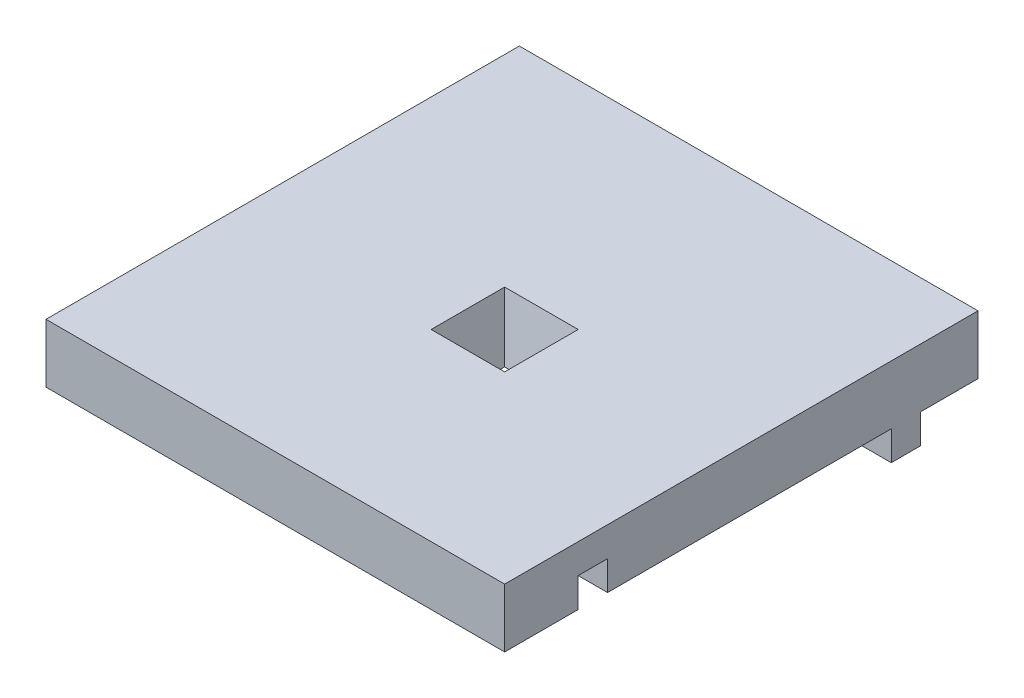
ISO-10303-21;
HEADER;
FILE_DESCRIPTION(('STEP AP214'),'2;1');
FILE_NAME('part.step','',(''),(''),'','','');
FILE_SCHEMA(('AUTOMOTIVE_DESIGN { 1 0 10303 214 1 1 1 1 }'));
ENDSEC;
DATA;
#1=APPLICATION_CONTEXT('core data for automotive mechanical design processes');
#2=APPLICATION_PROTOCOL_DEFINITION('international standard','automotive_design',2000,#1);
#3=PRODUCT_CONTEXT('',#1,'mechanical');
#4=PRODUCT('Part','Part','',(#3));
#5=PRODUCT_RELATED_PRODUCT_CATEGORY('part','',(#4));
#6=PRODUCT_DEFINITION_FORMATION('','',#4);
#7=PRODUCT_DEFINITION_CONTEXT('part definition',#1,'design');
#8=PRODUCT_DEFINITION('design','',#6,#7);
#9=PRODUCT_DEFINITION_SHAPE('','',#8);
#10=(LENGTH_UNIT() NAMED_UNIT(*) SI_UNIT(.MILLI.,.METRE.));
#11=(NAMED_UNIT(*) PLANE_ANGLE_UNIT() SI_UNIT($,.RADIAN.));
#12=(NAMED_UNIT(*) SI_UNIT($,.STERADIAN.) SOLID_ANGLE_UNIT());
#13=UNCERTAINTY_MEASURE_WITH_UNIT(LENGTH_MEASURE(1.E-05),#10,'distance_accuracy_value','');
#14=(GEOMETRIC_REPRESENTATION_CONTEXT(3) GLOBAL_UNCERTAINTY_ASSIGNED_CONTEXT((#13)) GLOBAL_UNIT_ASSIGNED_CONTEXT((#10,
#11,#12)) REPRESENTATION_CONTEXT('',''));
#15=CARTESIAN_POINT('',(0.,0.,0.));
#16=DIRECTION('',(0.,0.,1.));
#17=DIRECTION('',(1.,0.,0.));
#18=AXIS2_PLACEMENT_3D('',#15,#16,#17);
#19=CARTESIAN_POINT('',(0.,0.,0.));
#20=DIRECTION('',(0.,1.,0.));
#21=DIRECTION('',(0.,0.,1.));
#22=AXIS2_PLACEMENT_3D('',#19,#20,#21);
#23=PLANE('',#22);
#24=DIRECTION('',(-1.,0.,0.));
#25=VECTOR('',#24,1.);
#26=CARTESIAN_POINT('',(18.7,0.,18.9946920771661));
#27=LINE('',#26,#25);
#28=CARTESIAN_POINT('',(17.9946920771661,0.,18.9946920771661));
#29=VERTEX_POINT('',#28);
#30=CARTESIAN_POINT('',(14.4053079228339,0.,18.9946920771661));
#31=VERTEX_POINT('',#30);
#32=EDGE_CURVE('E581',#29,#31,#27,.T.);
#33=ORIENTED_EDGE('',*,*,#32,.F.);
#34=DIRECTION('',(0.,0.,1.));
#35=VECTOR('',#34,1.);
#36=CARTESIAN_POINT('',(17.9946920771661,0.,19.7));
#37=LINE('',#36,#35);
#38=CARTESIAN_POINT('',(17.9946920771661,0.,15.4053079228339));
#39=VERTEX_POINT('',#38);
#40=EDGE_CURVE('E240',#39,#29,#37,.T.);
#41=ORIENTED_EDGE('',*,*,#40,.F.);
#42=DIRECTION('',(1.,0.,0.));
#43=VECTOR('',#42,1.);
#44=CARTESIAN_POINT('',(18.7,0.,15.4053079228339));
#45=LINE('',#44,#43);
#46=CARTESIAN_POINT('',(14.4053079228339,0.,15.4053079228339));
#47=VERTEX_POINT('',#46);
#48=EDGE_CURVE('E236',#47,#39,#45,.T.);
#49=ORIENTED_EDGE('',*,*,#48,.F.);
#50=DIRECTION('',(0.,0.,-1.));
#51=VECTOR('',#50,1.);
#52=CARTESIAN_POINT('',(14.4053079228339,0.,19.7));
#53=LINE('',#52,#51);
#54=EDGE_CURVE('E207',#31,#47,#53,.T.);
#55=ORIENTED_EDGE('',*,*,#54,.F.);
#56=EDGE_LOOP('',(#33,#41,#49,#55));
#57=FACE_BOUND('',#56,.T.);
#58=DIRECTION('',(1.,0.,0.));
#59=VECTOR('',#58,1.);
#60=CARTESIAN_POINT('',(29.2,0.,3.9));
#61=LINE('',#60,#59);
#62=CARTESIAN_POINT('',(29.2,0.,3.9));
#63=VERTEX_POINT('',#62);
#64=CARTESIAN_POINT('',(31.2,0.,3.9));
#65=VERTEX_POINT('',#64);
#66=EDGE_CURVE('E259',#63,#65,#61,.T.);
#67=ORIENTED_EDGE('',*,*,#66,.F.);
#68=DIRECTION('',(0.,0.,-1.));
#69=VECTOR('',#68,1.);
#70=CARTESIAN_POINT('',(29.2,0.,5.9));
#71=LINE('',#70,#69);
#72=CARTESIAN_POINT('',(29.2,0.,5.9));
#73=VERTEX_POINT('',#72);
#74=EDGE_CURVE('E239',#73,#63,#71,.T.);
#75=ORIENTED_EDGE('',*,*,#74,.F.);
#76=DIRECTION('',(-1.,0.,0.));
#77=VECTOR('',#76,1.);
#78=CARTESIAN_POINT('',(29.2,0.,5.9));
#79=LINE('',#78,#77);
#80=CARTESIAN_POINT('',(31.2,0.,5.9));
#81=VERTEX_POINT('',#80);
#82=EDGE_CURVE('E246',#81,#73,#79,.T.);
#83=ORIENTED_EDGE('',*,*,#82,.F.);
#84=DIRECTION('',(0.,0.,-1.));
#85=VECTOR('',#84,1.);
#86=CARTESIAN_POINT('',(31.2,0.,0.));
#87=LINE('',#86,#85);
#88=CARTESIAN_POINT('',(31.2,0.,25.2));
#89=VERTEX_POINT('',#88);
#90=EDGE_CURVE('E426',#89,#81,#87,.T.);
#91=ORIENTED_EDGE('',*,*,#90,.F.);
#92=DIRECTION('',(1.,0.,0.));
#93=VECTOR('',#92,1.);
#94=CARTESIAN_POINT('',(29.2,0.,25.2));
#95=LINE('',#94,#93);
#96=CARTESIAN_POINT('',(29.2,0.,25.2));
#97=VERTEX_POINT('',#96);
#98=EDGE_CURVE('E380',#97,#89,#95,.T.);
#99=ORIENTED_EDGE('',*,*,#98,.F.);
#100=DIRECTION('',(0.,0.,-1.));
#101=VECTOR('',#100,1.);
#102=CARTESIAN_POINT('',(29.2,0.,27.2));
#103=LINE('',#102,#101);
#104=CARTESIAN_POINT('',(29.2,0.,27.2));
#105=VERTEX_POINT('',#104);
#106=EDGE_CURVE('E318',#105,#97,#103,.T.);
#107=ORIENTED_EDGE('',*,*,#106,.F.);
#108=DIRECTION('',(-1.,0.,0.));
#109=VECTOR('',#108,1.);
#110=CARTESIAN_POINT('',(29.2,0.,27.2));
#111=LINE('',#110,#109);
#112=CARTESIAN_POINT('',(31.2,0.,27.2));
#113=VERTEX_POINT('',#112);
#114=EDGE_CURVE('E366',#113,#105,#111,.T.);
#115=ORIENTED_EDGE('',*,*,#114,.F.);
#116=CARTESIAN_POINT('',(31.2,0.,32.2));
#117=VERTEX_POINT('',#116);
#118=EDGE_CURVE('E422',#117,#113,#87,.T.);
#119=ORIENTED_EDGE('',*,*,#118,.F.);
#120=DIRECTION('',(1.,0.,0.));
#121=VECTOR('',#120,1.);
#122=CARTESIAN_POINT('',(0.,0.,32.2));
#123=LINE('',#122,#121);
#124=CARTESIAN_POINT('',(0.,0.,32.2));
#125=VERTEX_POINT('',#124);
#126=EDGE_CURVE('E417',#125,#117,#123,.T.);
#127=ORIENTED_EDGE('',*,*,#126,.F.);
#128=DIRECTION('',(0.,0.,1.));
#129=VECTOR('',#128,1.);
#130=CARTESIAN_POINT('',(0.,0.,0.));
#131=LINE('',#130,#129);
#132=CARTESIAN_POINT('',(0.,0.,27.2));
#133=VERTEX_POINT('',#132);
#134=EDGE_CURVE('E352',#133,#125,#131,.T.);
#135=ORIENTED_EDGE('',*,*,#134,.F.);
#136=DIRECTION('',(-1.,0.,0.));
#137=VECTOR('',#136,1.);
#138=CARTESIAN_POINT('',(0.,0.,27.2));
#139=LINE('',#138,#137);
#140=CARTESIAN_POINT('',(2.,0.,27.2));
#141=VERTEX_POINT('',#140);
#142=EDGE_CURVE('E283',#141,#133,#139,.T.);
#143=ORIENTED_EDGE('',*,*,#142,.F.);
#144=DIRECTION('',(0.,0.,1.));
#145=VECTOR('',#144,1.);
#146=CARTESIAN_POINT('',(2.,0.,27.2));
#147=LINE('',#146,#145);
#148=CARTESIAN_POINT('',(2.,0.,25.2));
#149=VERTEX_POINT('',#148);
#150=EDGE_CURVE('E296',#149,#141,#147,.T.);
#151=ORIENTED_EDGE('',*,*,#150,.F.);
#152=DIRECTION('',(1.,0.,0.));
#153=VECTOR('',#152,1.);
#154=CARTESIAN_POINT('',(0.,0.,25.2));
#155=LINE('',#154,#153);
#156=CARTESIAN_POINT('',(0.,0.,25.2));
#157=VERTEX_POINT('',#156);
#158=EDGE_CURVE('E277',#157,#149,#155,.T.);
#159=ORIENTED_EDGE('',*,*,#158,.F.);
#160=CARTESIAN_POINT('',(0.,0.,5.9));
#161=VERTEX_POINT('',#160);
#162=EDGE_CURVE('E418',#161,#157,#131,.T.);
#163=ORIENTED_EDGE('',*,*,#162,.F.);
#164=DIRECTION('',(-1.,0.,0.));
#165=VECTOR('',#164,1.);
#166=CARTESIAN_POINT('',(0.,0.,5.9));
#167=LINE('',#166,#165);
#168=CARTESIAN_POINT('',(2.,0.,5.9));
#169=VERTEX_POINT('',#168);
#170=EDGE_CURVE('E324',#169,#161,#167,.T.);
#171=ORIENTED_EDGE('',*,*,#170,.F.);
#172=DIRECTION('',(0.,0.,1.));
#173=VECTOR('',#172,1.);
#174=CARTESIAN_POINT('',(2.,0.,5.9));
#175=LINE('',#174,#173);
#176=CARTESIAN_POINT('',(2.,0.,3.9));
#177=VERTEX_POINT('',#176);
#178=EDGE_CURVE('E341',#177,#169,#175,.T.);
#179=ORIENTED_EDGE('',*,*,#178,.F.);
#180=DIRECTION('',(1.,0.,0.));
#181=VECTOR('',#180,1.);
#182=CARTESIAN_POINT('',(0.,0.,3.9));
#183=LINE('',#182,#181);
#184=CARTESIAN_POINT('',(0.,0.,3.9));
#185=VERTEX_POINT('',#184);
#186=EDGE_CURVE('E337',#185,#177,#183,.T.);
#187=ORIENTED_EDGE('',*,*,#186,.F.);
#188=CARTESIAN_POINT('',(0.,0.,0.));
#189=VERTEX_POINT('',#188);
#190=EDGE_CURVE('E413',#189,#185,#131,.T.);
#191=ORIENTED_EDGE('',*,*,#190,.F.);
#192=DIRECTION('',(-1.,0.,0.));
#193=VECTOR('',#192,1.);
#194=CARTESIAN_POINT('',(0.,0.,0.));
#195=LINE('',#194,#193);
#196=CARTESIAN_POINT('',(31.2,0.,0.));
#197=VERTEX_POINT('',#196);
#198=EDGE_CURVE('E403',#197,#189,#195,.T.);
#199=ORIENTED_EDGE('',*,*,#198,.F.);
#200=EDGE_CURVE('E421',#65,#197,#87,.T.);
#201=ORIENTED_EDGE('',*,*,#200,.F.);
#202=EDGE_LOOP('',(#67,#75,#83,#91,#99,#107,#115,#119,#127,#135,#143,#151,#159,#163,#171,#179,
#187,#191,#199,#201));
#203=FACE_BOUND('',#202,.T.);
#204=ADVANCED_FACE('F39',(#57,#203),#23,.F.);
#205=CARTESIAN_POINT('',(0.,4.,0.));
#206=DIRECTION('',(1.,0.,0.));
#207=DIRECTION('',(0.,0.,-1.));
#208=AXIS2_PLACEMENT_3D('',#205,#206,#207);
#209=PLANE('',#208);
#210=DIRECTION('',(0.,0.,-1.));
#211=VECTOR('',#210,1.);
#212=CARTESIAN_POINT('',(0.,2.,5.9));
#213=LINE('',#212,#211);
#214=CARTESIAN_POINT('',(0.,2.,5.9));
#215=VERTEX_POINT('',#214);
#216=CARTESIAN_POINT('',(0.,2.,3.9));
#217=VERTEX_POINT('',#216);
#218=EDGE_CURVE('E319',#215,#217,#213,.T.);
#219=ORIENTED_EDGE('',*,*,#218,.F.);
#220=DIRECTION('',(0.,-1.,0.));
#221=VECTOR('',#220,1.);
#222=CARTESIAN_POINT('',(0.,2.,5.9));
#223=LINE('',#222,#221);
#224=EDGE_CURVE('E348',#215,#161,#223,.T.);
#225=ORIENTED_EDGE('',*,*,#224,.T.);
#226=ORIENTED_EDGE('',*,*,#162,.T.);
#227=DIRECTION('',(0.,1.,0.));
#228=VECTOR('',#227,1.);
#229=CARTESIAN_POINT('',(0.,-2.,25.2));
#230=LINE('',#229,#228);
#231=CARTESIAN_POINT('',(0.,-2.,25.2));
#232=VERTEX_POINT('',#231);
#233=EDGE_CURVE('E314',#232,#157,#230,.T.);
#234=ORIENTED_EDGE('',*,*,#233,.F.);
#235=DIRECTION('',(0.,0.,-1.));
#236=VECTOR('',#235,1.);
#237=CARTESIAN_POINT('',(0.,-2.,27.2));
#238=LINE('',#237,#236);
#239=CARTESIAN_POINT('',(0.,-2.,27.2));
#240=VERTEX_POINT('',#239);
#241=EDGE_CURVE('E278',#240,#232,#238,.T.);
#242=ORIENTED_EDGE('',*,*,#241,.F.);
#243=DIRECTION('',(0.,1.,0.));
#244=VECTOR('',#243,1.);
#245=CARTESIAN_POINT('',(0.,-2.,27.2));
#246=LINE('',#245,#244);
#247=EDGE_CURVE('E292',#240,#133,#246,.T.);
#248=ORIENTED_EDGE('',*,*,#247,.T.);
#249=ORIENTED_EDGE('',*,*,#134,.T.);
#250=DIRECTION('',(0.,-1.,0.));
#251=VECTOR('',#250,1.);
#252=CARTESIAN_POINT('',(0.,4.,32.2));
#253=LINE('',#252,#251);
#254=CARTESIAN_POINT('',(0.,4.,32.2));
#255=VERTEX_POINT('',#254);
#256=EDGE_CURVE('E11',#255,#125,#253,.T.);
#257=ORIENTED_EDGE('',*,*,#256,.F.);
#258=DIRECTION('',(0.,0.,1.));
#259=VECTOR('',#258,1.);
#260=CARTESIAN_POINT('',(0.,4.,0.));
#261=LINE('',#260,#259);
#262=CARTESIAN_POINT('',(0.,4.,0.));
#263=VERTEX_POINT('',#262);
#264=EDGE_CURVE('E398',#263,#255,#261,.T.);
#265=ORIENTED_EDGE('',*,*,#264,.F.);
#266=DIRECTION('',(0.,-1.,0.));
#267=VECTOR('',#266,1.);
#268=CARTESIAN_POINT('',(0.,4.,0.));
#269=LINE('',#268,#267);
#270=EDGE_CURVE('E412',#263,#189,#269,.T.);
#271=ORIENTED_EDGE('',*,*,#270,.T.);
#272=ORIENTED_EDGE('',*,*,#190,.T.);
#273=DIRECTION('',(0.,-1.,0.));
#274=VECTOR('',#273,1.);
#275=CARTESIAN_POINT('',(0.,2.,3.9));
#276=LINE('',#275,#274);
#277=EDGE_CURVE('E336',#217,#185,#276,.T.);
#278=ORIENTED_EDGE('',*,*,#277,.F.);
#279=EDGE_LOOP('',(#219,#225,#226,#234,#242,#248,#249,#257,#265,#271,#272,#278));
#280=FACE_BOUND('',#279,.T.);
#281=ADVANCED_FACE('F41',(#280),#209,.F.);
#282=CARTESIAN_POINT('',(0.,4.,32.2));
#283=DIRECTION('',(0.,0.,-1.));
#284=DIRECTION('',(-1.,0.,0.));
#285=AXIS2_PLACEMENT_3D('',#282,#283,#284);
#286=PLANE('',#285);
#287=ORIENTED_EDGE('',*,*,#126,.T.);
#288=DIRECTION('',(0.,-1.,0.));
#289=VECTOR('',#288,1.);
#290=CARTESIAN_POINT('',(31.2,4.,32.2));
#291=LINE('',#290,#289);
#292=CARTESIAN_POINT('',(31.2,4.,32.2));
#293=VERTEX_POINT('',#292);
#294=EDGE_CURVE('E48',#293,#117,#291,.T.);
#295=ORIENTED_EDGE('',*,*,#294,.F.);
#296=DIRECTION('',(1.,0.,0.));
#297=VECTOR('',#296,1.);
#298=CARTESIAN_POINT('',(0.,4.,32.2));
#299=LINE('',#298,#297);
#300=EDGE_CURVE('E402',#255,#293,#299,.T.);
#301=ORIENTED_EDGE('',*,*,#300,.F.);
#302=ORIENTED_EDGE('',*,*,#256,.T.);
#303=EDGE_LOOP('',(#287,#295,#301,#302));
#304=FACE_BOUND('',#303,.T.);
#305=ADVANCED_FACE('F484',(#304),#286,.F.);
#306=CARTESIAN_POINT('',(31.2,4.,0.));
#307=DIRECTION('',(-1.,0.,0.));
#308=DIRECTION('',(0.,0.,1.));
#309=AXIS2_PLACEMENT_3D('',#306,#307,#308);
#310=PLANE('',#309);
#311=ORIENTED_EDGE('',*,*,#118,.T.);
#312=DIRECTION('',(0.,-1.,0.));
#313=VECTOR('',#312,1.);
#314=CARTESIAN_POINT('',(31.2,2.,27.2));
#315=LINE('',#314,#313);
#316=CARTESIAN_POINT('',(31.2,2.,27.2));
#317=VERTEX_POINT('',#316);
#318=EDGE_CURVE('E388',#317,#113,#315,.T.);
#319=ORIENTED_EDGE('',*,*,#318,.F.);
#320=DIRECTION('',(0.,0.,1.));
#321=VECTOR('',#320,1.);
#322=CARTESIAN_POINT('',(31.2,2.,27.2));
#323=LINE('',#322,#321);
#324=CARTESIAN_POINT('',(31.2,2.,25.2));
#325=VERTEX_POINT('',#324);
#326=EDGE_CURVE('E370',#325,#317,#323,.T.);
#327=ORIENTED_EDGE('',*,*,#326,.F.);
#328=DIRECTION('',(0.,-1.,0.));
#329=VECTOR('',#328,1.);
#330=CARTESIAN_POINT('',(31.2,2.,25.2));
#331=LINE('',#330,#329);
#332=EDGE_CURVE('E391',#325,#89,#331,.T.);
#333=ORIENTED_EDGE('',*,*,#332,.T.);
#334=ORIENTED_EDGE('',*,*,#90,.T.);
#335=DIRECTION('',(0.,1.,0.));
#336=VECTOR('',#335,1.);
#337=CARTESIAN_POINT('',(31.2,-2.,5.9));
#338=LINE('',#337,#336);
#339=CARTESIAN_POINT('',(31.2,-2.,5.9));
#340=VERTEX_POINT('',#339);
#341=EDGE_CURVE('E268',#340,#81,#338,.T.);
#342=ORIENTED_EDGE('',*,*,#341,.F.);
#343=DIRECTION('',(0.,0.,1.));
#344=VECTOR('',#343,1.);
#345=CARTESIAN_POINT('',(31.2,-2.,5.9));
#346=LINE('',#345,#344);
#347=CARTESIAN_POINT('',(31.2,-2.,3.9));
#348=VERTEX_POINT('',#347);
#349=EDGE_CURVE('E249',#348,#340,#346,.T.);
#350=ORIENTED_EDGE('',*,*,#349,.F.);
#351=DIRECTION('',(0.,1.,0.));
#352=VECTOR('',#351,1.);
#353=CARTESIAN_POINT('',(31.2,-2.,3.9));
#354=LINE('',#353,#352);
#355=EDGE_CURVE('E271',#348,#65,#354,.T.);
#356=ORIENTED_EDGE('',*,*,#355,.T.);
#357=ORIENTED_EDGE('',*,*,#200,.T.);
#358=DIRECTION('',(0.,-1.,0.));
#359=VECTOR('',#358,1.);
#360=CARTESIAN_POINT('',(31.2,4.,0.));
#361=LINE('',#360,#359);
#362=CARTESIAN_POINT('',(31.2,4.,0.));
#363=VERTEX_POINT('',#362);
#364=EDGE_CURVE('E432',#363,#197,#361,.T.);
#365=ORIENTED_EDGE('',*,*,#364,.F.);
#366=DIRECTION('',(0.,0.,-1.));
#367=VECTOR('',#366,1.);
#368=CARTESIAN_POINT('',(31.2,4.,0.));
#369=LINE('',#368,#367);
#370=EDGE_CURVE('E406',#293,#363,#369,.T.);
#371=ORIENTED_EDGE('',*,*,#370,.F.);
#372=ORIENTED_EDGE('',*,*,#294,.T.);
#373=EDGE_LOOP('',(#311,#319,#327,#333,#334,#342,#350,#356,#357,#365,#371,#372));
#374=FACE_BOUND('',#373,.T.);
#375=ADVANCED_FACE('F441',(#374),#310,.F.);
#376=CARTESIAN_POINT('',(0.,4.,0.));
#377=DIRECTION('',(0.,0.,1.));
#378=DIRECTION('',(1.,0.,0.));
#379=AXIS2_PLACEMENT_3D('',#376,#377,#378);
#380=PLANE('',#379);
#381=ORIENTED_EDGE('',*,*,#198,.T.);
#382=ORIENTED_EDGE('',*,*,#270,.F.);
#383=DIRECTION('',(-1.,0.,0.));
#384=VECTOR('',#383,1.);
#385=CARTESIAN_POINT('',(0.,4.,0.));
#386=LINE('',#385,#384);
#387=EDGE_CURVE('E409',#363,#263,#386,.T.);
#388=ORIENTED_EDGE('',*,*,#387,.F.);
#389=ORIENTED_EDGE('',*,*,#364,.T.);
#390=EDGE_LOOP('',(#381,#382,#388,#389));
#391=FACE_BOUND('',#390,.T.);
#392=ADVANCED_FACE('F474',(#391),#380,.F.);
#393=CARTESIAN_POINT('',(0.,4.,0.));
#394=DIRECTION('',(0.,1.,0.));
#395=DIRECTION('',(0.,0.,1.));
#396=AXIS2_PLACEMENT_3D('',#393,#394,#395);
#397=PLANE('',#396);
#398=DIRECTION('',(0.,0.,-1.));
#399=VECTOR('',#398,1.);
#400=CARTESIAN_POINT('',(18.7,4.,19.7));
#401=LINE('',#400,#399);
#402=CARTESIAN_POINT('',(18.7,4.,19.7));
#403=VERTEX_POINT('',#402);
#404=CARTESIAN_POINT('',(18.7,4.,14.7));
#405=VERTEX_POINT('',#404);
#406=EDGE_CURVE('E63',#403,#405,#401,.T.);
#407=ORIENTED_EDGE('',*,*,#406,.F.);
#408=DIRECTION('',(1.,0.,0.));
#409=VECTOR('',#408,1.);
#410=CARTESIAN_POINT('',(18.7,4.,19.7));
#411=LINE('',#410,#409);
#412=CARTESIAN_POINT('',(13.7,4.,19.7));
#413=VERTEX_POINT('',#412);
#414=EDGE_CURVE('E222',#413,#403,#411,.T.);
#415=ORIENTED_EDGE('',*,*,#414,.F.);
#416=DIRECTION('',(0.,0.,1.));
#417=VECTOR('',#416,1.);
#418=CARTESIAN_POINT('',(13.7,4.,19.7));
#419=LINE('',#418,#417);
#420=CARTESIAN_POINT('',(13.7,4.,14.7));
#421=VERTEX_POINT('',#420);
#422=EDGE_CURVE('E204',#421,#413,#419,.T.);
#423=ORIENTED_EDGE('',*,*,#422,.F.);
#424=DIRECTION('',(-1.,0.,0.));
#425=VECTOR('',#424,1.);
#426=CARTESIAN_POINT('',(18.7,4.,14.7));
#427=LINE('',#426,#425);
#428=EDGE_CURVE('E214',#405,#421,#427,.T.);
#429=ORIENTED_EDGE('',*,*,#428,.F.);
#430=EDGE_LOOP('',(#407,#415,#423,#429));
#431=FACE_BOUND('',#430,.T.);
#432=ORIENTED_EDGE('',*,*,#264,.T.);
#433=ORIENTED_EDGE('',*,*,#300,.T.);
#434=ORIENTED_EDGE('',*,*,#370,.T.);
#435=ORIENTED_EDGE('',*,*,#387,.T.);
#436=EDGE_LOOP('',(#432,#433,#434,#435));
#437=FACE_BOUND('',#436,.T.);
#438=ADVANCED_FACE('F219',(#431,#437),#397,.T.);
#439=CARTESIAN_POINT('',(29.2,2.,27.2));
#440=DIRECTION('',(-1.,0.,0.));
#441=DIRECTION('',(0.,0.,1.));
#442=AXIS2_PLACEMENT_3D('',#439,#440,#441);
#443=PLANE('',#442);
#444=ORIENTED_EDGE('',*,*,#106,.T.);
#445=DIRECTION('',(0.,-1.,0.));
#446=VECTOR('',#445,1.);
#447=CARTESIAN_POINT('',(29.2,2.,25.2));
#448=LINE('',#447,#446);
#449=CARTESIAN_POINT('',(29.2,2.,25.2));
#450=VERTEX_POINT('',#449);
#451=EDGE_CURVE('E377',#450,#97,#448,.T.);
#452=ORIENTED_EDGE('',*,*,#451,.F.);
#453=DIRECTION('',(0.,0.,-1.));
#454=VECTOR('',#453,1.);
#455=CARTESIAN_POINT('',(29.2,2.,27.2));
#456=LINE('',#455,#454);
#457=CARTESIAN_POINT('',(29.2,2.,27.2));
#458=VERTEX_POINT('',#457);
#459=EDGE_CURVE('E361',#458,#450,#456,.T.);
#460=ORIENTED_EDGE('',*,*,#459,.F.);
#461=DIRECTION('',(0.,-1.,0.));
#462=VECTOR('',#461,1.);
#463=CARTESIAN_POINT('',(29.2,2.,27.2));
#464=LINE('',#463,#462);
#465=EDGE_CURVE('E342',#458,#105,#464,.T.);
#466=ORIENTED_EDGE('',*,*,#465,.T.);
#467=EDGE_LOOP('',(#444,#452,#460,#466));
#468=FACE_BOUND('',#467,.T.);
#469=ADVANCED_FACE('F504',(#468),#443,.F.);
#470=CARTESIAN_POINT('',(29.2,2.,27.2));
#471=DIRECTION('',(0.,0.,1.));
#472=DIRECTION('',(1.,0.,0.));
#473=AXIS2_PLACEMENT_3D('',#470,#471,#472);
#474=PLANE('',#473);
#475=ORIENTED_EDGE('',*,*,#114,.T.);
#476=ORIENTED_EDGE('',*,*,#465,.F.);
#477=DIRECTION('',(-1.,0.,0.));
#478=VECTOR('',#477,1.);
#479=CARTESIAN_POINT('',(29.2,2.,27.2));
#480=LINE('',#479,#478);
#481=EDGE_CURVE('E373',#317,#458,#480,.T.);
#482=ORIENTED_EDGE('',*,*,#481,.F.);
#483=ORIENTED_EDGE('',*,*,#318,.T.);
#484=EDGE_LOOP('',(#475,#476,#482,#483));
#485=FACE_BOUND('',#484,.T.);
#486=ADVANCED_FACE('F452',(#485),#474,.F.);
#487=CARTESIAN_POINT('',(29.2,2.,25.2));
#488=DIRECTION('',(0.,0.,-1.));
#489=DIRECTION('',(-1.,0.,0.));
#490=AXIS2_PLACEMENT_3D('',#487,#488,#489);
#491=PLANE('',#490);
#492=ORIENTED_EDGE('',*,*,#98,.T.);
#493=ORIENTED_EDGE('',*,*,#332,.F.);
#494=DIRECTION('',(1.,0.,0.));
#495=VECTOR('',#494,1.);
#496=CARTESIAN_POINT('',(29.2,2.,25.2));
#497=LINE('',#496,#495);
#498=EDGE_CURVE('E365',#450,#325,#497,.T.);
#499=ORIENTED_EDGE('',*,*,#498,.F.);
#500=ORIENTED_EDGE('',*,*,#451,.T.);
#501=EDGE_LOOP('',(#492,#493,#499,#500));
#502=FACE_BOUND('',#501,.T.);
#503=ADVANCED_FACE('F462',(#502),#491,.F.);
#504=CARTESIAN_POINT('',(0.,2.,0.));
#505=DIRECTION('',(0.,-1.,0.));
#506=DIRECTION('',(0.,0.,-1.));
#507=AXIS2_PLACEMENT_3D('',#504,#505,#506);
#508=PLANE('',#507);
#509=ORIENTED_EDGE('',*,*,#459,.T.);
#510=ORIENTED_EDGE('',*,*,#498,.T.);
#511=ORIENTED_EDGE('',*,*,#326,.T.);
#512=ORIENTED_EDGE('',*,*,#481,.T.);
#513=EDGE_LOOP('',(#509,#510,#511,#512));
#514=FACE_BOUND('',#513,.T.);
#515=ADVANCED_FACE('F459',(#514),#508,.T.);
#516=CARTESIAN_POINT('',(0.,2.,5.9));
#517=DIRECTION('',(0.,0.,1.));
#518=DIRECTION('',(1.,0.,0.));
#519=AXIS2_PLACEMENT_3D('',#516,#517,#518);
#520=PLANE('',#519);
#521=ORIENTED_EDGE('',*,*,#170,.T.);
#522=ORIENTED_EDGE('',*,*,#224,.F.);
#523=DIRECTION('',(-1.,0.,0.));
#524=VECTOR('',#523,1.);
#525=CARTESIAN_POINT('',(0.,2.,5.9));
#526=LINE('',#525,#524);
#527=CARTESIAN_POINT('',(2.,2.,5.9));
#528=VERTEX_POINT('',#527);
#529=EDGE_CURVE('E332',#528,#215,#526,.T.);
#530=ORIENTED_EDGE('',*,*,#529,.F.);
#531=DIRECTION('',(0.,-1.,0.));
#532=VECTOR('',#531,1.);
#533=CARTESIAN_POINT('',(2.,2.,5.9));
#534=LINE('',#533,#532);
#535=EDGE_CURVE('E353',#528,#169,#534,.T.);
#536=ORIENTED_EDGE('',*,*,#535,.T.);
#537=EDGE_LOOP('',(#521,#522,#530,#536));
#538=FACE_BOUND('',#537,.T.);
#539=ADVANCED_FACE('F518',(#538),#520,.F.);
#540=CARTESIAN_POINT('',(2.,2.,5.9));
#541=DIRECTION('',(1.,0.,0.));
#542=DIRECTION('',(0.,0.,-1.));
#543=AXIS2_PLACEMENT_3D('',#540,#541,#542);
#544=PLANE('',#543);
#545=ORIENTED_EDGE('',*,*,#178,.T.);
#546=ORIENTED_EDGE('',*,*,#535,.F.);
#547=DIRECTION('',(0.,0.,1.));
#548=VECTOR('',#547,1.);
#549=CARTESIAN_POINT('',(2.,2.,5.9));
#550=LINE('',#549,#548);
#551=CARTESIAN_POINT('',(2.,2.,3.9));
#552=VERTEX_POINT('',#551);
#553=EDGE_CURVE('E328',#552,#528,#550,.T.);
#554=ORIENTED_EDGE('',*,*,#553,.F.);
#555=DIRECTION('',(0.,-1.,0.));
#556=VECTOR('',#555,1.);
#557=CARTESIAN_POINT('',(2.,2.,3.9));
#558=LINE('',#557,#556);
#559=EDGE_CURVE('E356',#552,#177,#558,.T.);
#560=ORIENTED_EDGE('',*,*,#559,.T.);
#561=EDGE_LOOP('',(#545,#546,#554,#560));
#562=FACE_BOUND('',#561,.T.);
#563=ADVANCED_FACE('F523',(#562),#544,.F.);
#564=CARTESIAN_POINT('',(0.,2.,3.9));
#565=DIRECTION('',(0.,0.,-1.));
#566=DIRECTION('',(-1.,0.,0.));
#567=AXIS2_PLACEMENT_3D('',#564,#565,#566);
#568=PLANE('',#567);
#569=ORIENTED_EDGE('',*,*,#186,.T.);
#570=ORIENTED_EDGE('',*,*,#559,.F.);
#571=DIRECTION('',(1.,0.,0.));
#572=VECTOR('',#571,1.);
#573=CARTESIAN_POINT('',(0.,2.,3.9));
#574=LINE('',#573,#572);
#575=EDGE_CURVE('E323',#217,#552,#574,.T.);
#576=ORIENTED_EDGE('',*,*,#575,.F.);
#577=ORIENTED_EDGE('',*,*,#277,.T.);
#578=EDGE_LOOP('',(#569,#570,#576,#577));
#579=FACE_BOUND('',#578,.T.);
#580=ADVANCED_FACE('F519',(#579),#568,.F.);
#581=CARTESIAN_POINT('',(0.,2.,0.));
#582=DIRECTION('',(0.,-1.,0.));
#583=DIRECTION('',(0.,0.,-1.));
#584=AXIS2_PLACEMENT_3D('',#581,#582,#583);
#585=PLANE('',#584);
#586=ORIENTED_EDGE('',*,*,#218,.T.);
#587=ORIENTED_EDGE('',*,*,#575,.T.);
#588=ORIENTED_EDGE('',*,*,#553,.T.);
#589=ORIENTED_EDGE('',*,*,#529,.T.);
#590=EDGE_LOOP('',(#586,#587,#588,#589));
#591=FACE_BOUND('',#590,.T.);
#592=ADVANCED_FACE('F522',(#591),#585,.T.);
#593=CARTESIAN_POINT('',(0.,-2.,25.2));
#594=DIRECTION('',(0.,0.,1.));
#595=DIRECTION('',(1.,0.,0.));
#596=AXIS2_PLACEMENT_3D('',#593,#594,#595);
#597=PLANE('',#596);
#598=ORIENTED_EDGE('',*,*,#158,.T.);
#599=DIRECTION('',(0.,1.,0.));
#600=VECTOR('',#599,1.);
#601=CARTESIAN_POINT('',(2.,-2.,25.2));
#602=LINE('',#601,#600);
#603=CARTESIAN_POINT('',(2.,-2.,25.2));
#604=VERTEX_POINT('',#603);
#605=EDGE_CURVE('E310',#604,#149,#602,.T.);
#606=ORIENTED_EDGE('',*,*,#605,.F.);
#607=DIRECTION('',(1.,0.,0.));
#608=VECTOR('',#607,1.);
#609=CARTESIAN_POINT('',(0.,-2.,25.2));
#610=LINE('',#609,#608);
#611=EDGE_CURVE('E282',#232,#604,#610,.T.);
#612=ORIENTED_EDGE('',*,*,#611,.F.);
#613=ORIENTED_EDGE('',*,*,#233,.T.);
#614=EDGE_LOOP('',(#598,#606,#612,#613));
#615=FACE_BOUND('',#614,.T.);
#616=ADVANCED_FACE('F533',(#615),#597,.F.);
#617=CARTESIAN_POINT('',(2.,-2.,27.2));
#618=DIRECTION('',(-1.,0.,0.));
#619=DIRECTION('',(0.,0.,1.));
#620=AXIS2_PLACEMENT_3D('',#617,#618,#619);
#621=PLANE('',#620);
#622=ORIENTED_EDGE('',*,*,#150,.T.);
#623=DIRECTION('',(0.,1.,0.));
#624=VECTOR('',#623,1.);
#625=CARTESIAN_POINT('',(2.,-2.,27.2));
#626=LINE('',#625,#624);
#627=CARTESIAN_POINT('',(2.,-2.,27.2));
#628=VERTEX_POINT('',#627);
#629=EDGE_CURVE('E306',#628,#141,#626,.T.);
#630=ORIENTED_EDGE('',*,*,#629,.F.);
#631=DIRECTION('',(0.,0.,1.));
#632=VECTOR('',#631,1.);
#633=CARTESIAN_POINT('',(2.,-2.,27.2));
#634=LINE('',#633,#632);
#635=EDGE_CURVE('E286',#604,#628,#634,.T.);
#636=ORIENTED_EDGE('',*,*,#635,.F.);
#637=ORIENTED_EDGE('',*,*,#605,.T.);
#638=EDGE_LOOP('',(#622,#630,#636,#637));
#639=FACE_BOUND('',#638,.T.);
#640=ADVANCED_FACE('F537',(#639),#621,.F.);
#641=CARTESIAN_POINT('',(0.,-2.,27.2));
#642=DIRECTION('',(0.,0.,-1.));
#643=DIRECTION('',(-1.,0.,0.));
#644=AXIS2_PLACEMENT_3D('',#641,#642,#643);
#645=PLANE('',#644);
#646=ORIENTED_EDGE('',*,*,#142,.T.);
#647=ORIENTED_EDGE('',*,*,#247,.F.);
#648=DIRECTION('',(-1.,0.,0.));
#649=VECTOR('',#648,1.);
#650=CARTESIAN_POINT('',(0.,-2.,27.2));
#651=LINE('',#650,#649);
#652=EDGE_CURVE('E289',#628,#240,#651,.T.);
#653=ORIENTED_EDGE('',*,*,#652,.F.);
#654=ORIENTED_EDGE('',*,*,#629,.T.);
#655=EDGE_LOOP('',(#646,#647,#653,#654));
#656=FACE_BOUND('',#655,.T.);
#657=ADVANCED_FACE('F541',(#656),#645,.F.);
#658=CARTESIAN_POINT('',(0.,-2.,0.));
#659=DIRECTION('',(0.,-1.,0.));
#660=DIRECTION('',(0.,0.,-1.));
#661=AXIS2_PLACEMENT_3D('',#658,#659,#660);
#662=PLANE('',#661);
#663=ORIENTED_EDGE('',*,*,#241,.T.);
#664=ORIENTED_EDGE('',*,*,#611,.T.);
#665=ORIENTED_EDGE('',*,*,#635,.T.);
#666=ORIENTED_EDGE('',*,*,#652,.T.);
#667=EDGE_LOOP('',(#663,#664,#665,#666));
#668=FACE_BOUND('',#667,.T.);
#669=ADVANCED_FACE('F545',(#668),#662,.T.);
#670=CARTESIAN_POINT('',(29.2,-2.,5.9));
#671=DIRECTION('',(1.,0.,0.));
#672=DIRECTION('',(0.,0.,-1.));
#673=AXIS2_PLACEMENT_3D('',#670,#671,#672);
#674=PLANE('',#673);
#675=ORIENTED_EDGE('',*,*,#74,.T.);
#676=DIRECTION('',(0.,1.,0.));
#677=VECTOR('',#676,1.);
#678=CARTESIAN_POINT('',(29.2,-2.,3.9));
#679=LINE('',#678,#677);
#680=CARTESIAN_POINT('',(29.2,-2.,3.9));
#681=VERTEX_POINT('',#680);
#682=EDGE_CURVE('E274',#681,#63,#679,.T.);
#683=ORIENTED_EDGE('',*,*,#682,.F.);
#684=DIRECTION('',(0.,0.,-1.));
#685=VECTOR('',#684,1.);
#686=CARTESIAN_POINT('',(29.2,-2.,5.9));
#687=LINE('',#686,#685);
#688=CARTESIAN_POINT('',(29.2,-2.,5.9));
#689=VERTEX_POINT('',#688);
#690=EDGE_CURVE('E241',#689,#681,#687,.T.);
#691=ORIENTED_EDGE('',*,*,#690,.F.);
#692=DIRECTION('',(0.,1.,0.));
#693=VECTOR('',#692,1.);
#694=CARTESIAN_POINT('',(29.2,-2.,5.9));
#695=LINE('',#694,#693);
#696=EDGE_CURVE('E255',#689,#73,#695,.T.);
#697=ORIENTED_EDGE('',*,*,#696,.T.);
#698=EDGE_LOOP('',(#675,#683,#691,#697));
#699=FACE_BOUND('',#698,.T.);
#700=ADVANCED_FACE('F549',(#699),#674,.F.);
#701=CARTESIAN_POINT('',(29.2,-2.,3.9));
#702=DIRECTION('',(0.,0.,1.));
#703=DIRECTION('',(1.,0.,0.));
#704=AXIS2_PLACEMENT_3D('',#701,#702,#703);
#705=PLANE('',#704);
#706=ORIENTED_EDGE('',*,*,#66,.T.);
#707=ORIENTED_EDGE('',*,*,#355,.F.);
#708=DIRECTION('',(1.,0.,0.));
#709=VECTOR('',#708,1.);
#710=CARTESIAN_POINT('',(29.2,-2.,3.9));
#711=LINE('',#710,#709);
#712=EDGE_CURVE('E245',#681,#348,#711,.T.);
#713=ORIENTED_EDGE('',*,*,#712,.F.);
#714=ORIENTED_EDGE('',*,*,#682,.T.);
#715=EDGE_LOOP('',(#706,#707,#713,#714));
#716=FACE_BOUND('',#715,.T.);
#717=ADVANCED_FACE('F553',(#716),#705,.F.);
#718=CARTESIAN_POINT('',(29.2,-2.,5.9));
#719=DIRECTION('',(0.,0.,-1.));
#720=DIRECTION('',(-1.,0.,0.));
#721=AXIS2_PLACEMENT_3D('',#718,#719,#720);
#722=PLANE('',#721);
#723=ORIENTED_EDGE('',*,*,#82,.T.);
#724=ORIENTED_EDGE('',*,*,#696,.F.);
#725=DIRECTION('',(-1.,0.,0.));
#726=VECTOR('',#725,1.);
#727=CARTESIAN_POINT('',(29.2,-2.,5.9));
#728=LINE('',#727,#726);
#729=EDGE_CURVE('E252',#340,#689,#728,.T.);
#730=ORIENTED_EDGE('',*,*,#729,.F.);
#731=ORIENTED_EDGE('',*,*,#341,.T.);
#732=EDGE_LOOP('',(#723,#724,#730,#731));
#733=FACE_BOUND('',#732,.T.);
#734=ADVANCED_FACE('F557',(#733),#722,.F.);
#735=CARTESIAN_POINT('',(0.,-2.,0.));
#736=DIRECTION('',(0.,-1.,0.));
#737=DIRECTION('',(0.,0.,-1.));
#738=AXIS2_PLACEMENT_3D('',#735,#736,#737);
#739=PLANE('',#738);
#740=ORIENTED_EDGE('',*,*,#690,.T.);
#741=ORIENTED_EDGE('',*,*,#712,.T.);
#742=ORIENTED_EDGE('',*,*,#349,.T.);
#743=ORIENTED_EDGE('',*,*,#729,.T.);
#744=EDGE_LOOP('',(#740,#741,#742,#743));
#745=FACE_BOUND('',#744,.T.);
#746=ADVANCED_FACE('F561',(#745),#739,.T.);
#747=CARTESIAN_POINT('',(18.7,4.,19.7));
#748=DIRECTION('',(0.984807753012208,-0.173648177666931,0.));
#749=DIRECTION('',(0.173648177666931,0.984807753012208,0.));
#750=AXIS2_PLACEMENT_3D('',#747,#748,#749);
#751=PLANE('',#750);
#752=ORIENTED_EDGE('',*,*,#40,.T.);
#753=DIRECTION('',(0.171087869746036,0.970287525247814,0.171087869746036));
#754=VECTOR('',#753,1.);
#755=CARTESIAN_POINT('',(18.7,4.,19.7));
#756=LINE('',#755,#754);
#757=EDGE_CURVE('E229',#29,#403,#756,.T.);
#758=ORIENTED_EDGE('',*,*,#757,.T.);
#759=ORIENTED_EDGE('',*,*,#406,.T.);
#760=DIRECTION('',(0.171087869746036,0.970287525247814,-0.171087869746036));
#761=VECTOR('',#760,1.);
#762=CARTESIAN_POINT('',(18.5536447041288,3.16997787132099,14.8463552958712));
#763=LINE('',#762,#761);
#764=EDGE_CURVE('E211',#39,#405,#763,.T.);
#765=ORIENTED_EDGE('',*,*,#764,.F.);
#766=EDGE_LOOP('',(#752,#758,#759,#765));
#767=FACE_BOUND('',#766,.T.);
#768=ADVANCED_FACE('F565',(#767),#751,.F.);
#769=CARTESIAN_POINT('',(18.7,4.,19.7));
#770=DIRECTION('',(0.,-0.173648177666931,0.984807753012208));
#771=DIRECTION('',(0.,-0.984807753012208,-0.173648177666931));
#772=AXIS2_PLACEMENT_3D('',#769,#770,#771);
#773=PLANE('',#772);
#774=ORIENTED_EDGE('',*,*,#32,.T.);
#775=DIRECTION('',(-0.171087869746036,0.970287525247814,0.171087869746036));
#776=VECTOR('',#775,1.);
#777=CARTESIAN_POINT('',(13.7,4.,19.7));
#778=LINE('',#777,#776);
#779=EDGE_CURVE('E210',#31,#413,#778,.T.);
#780=ORIENTED_EDGE('',*,*,#779,.T.);
#781=ORIENTED_EDGE('',*,*,#414,.T.);
#782=ORIENTED_EDGE('',*,*,#757,.F.);
#783=EDGE_LOOP('',(#774,#780,#781,#782));
#784=FACE_BOUND('',#783,.T.);
#785=ADVANCED_FACE('F567',(#784),#773,.F.);
#786=CARTESIAN_POINT('',(13.7,4.,19.7));
#787=DIRECTION('',(-0.984807753012208,-0.173648177666931,0.));
#788=DIRECTION('',(0.173648177666931,-0.984807753012208,0.));
#789=AXIS2_PLACEMENT_3D('',#786,#787,#788);
#790=PLANE('',#789);
#791=ORIENTED_EDGE('',*,*,#54,.T.);
#792=DIRECTION('',(-0.171087869746036,0.970287525247814,-0.171087869746036));
#793=VECTOR('',#792,1.);
#794=CARTESIAN_POINT('',(13.8463552958712,3.16997787132099,14.8463552958712));
#795=LINE('',#794,#793);
#796=EDGE_CURVE('E55',#47,#421,#795,.T.);
#797=ORIENTED_EDGE('',*,*,#796,.T.);
#798=ORIENTED_EDGE('',*,*,#422,.T.);
#799=ORIENTED_EDGE('',*,*,#779,.F.);
#800=EDGE_LOOP('',(#791,#797,#798,#799));
#801=FACE_BOUND('',#800,.T.);
#802=ADVANCED_FACE('F201',(#801),#790,.F.);
#803=CARTESIAN_POINT('',(18.7,4.,14.7));
#804=DIRECTION('',(0.,-0.173648177666931,-0.984807753012208));
#805=DIRECTION('',(0.,0.984807753012208,-0.173648177666931));
#806=AXIS2_PLACEMENT_3D('',#803,#804,#805);
#807=PLANE('',#806);
#808=ORIENTED_EDGE('',*,*,#48,.T.);
#809=ORIENTED_EDGE('',*,*,#764,.T.);
#810=ORIENTED_EDGE('',*,*,#428,.T.);
#811=ORIENTED_EDGE('',*,*,#796,.F.);
#812=EDGE_LOOP('',(#808,#809,#810,#811));
#813=FACE_BOUND('',#812,.T.);
#814=ADVANCED_FACE('F215',(#813),#807,.F.);
#815=CLOSED_SHELL('',(#204,#281,#305,#375,#392,#438,#469,#486,#503,#515,#539,#563,#580,#592,
#616,#640,#657,#669,#700,#717,#734,#746,#768,#785,#802,#814));
#816=MANIFOLD_SOLID_BREP('B2',#815);
#817=ADVANCED_BREP_SHAPE_REPRESENTATION('',(#18,#816),#14);
#818=SHAPE_DEFINITION_REPRESENTATION(#9,#817);
ENDSEC;
END-ISO-10303-21;
